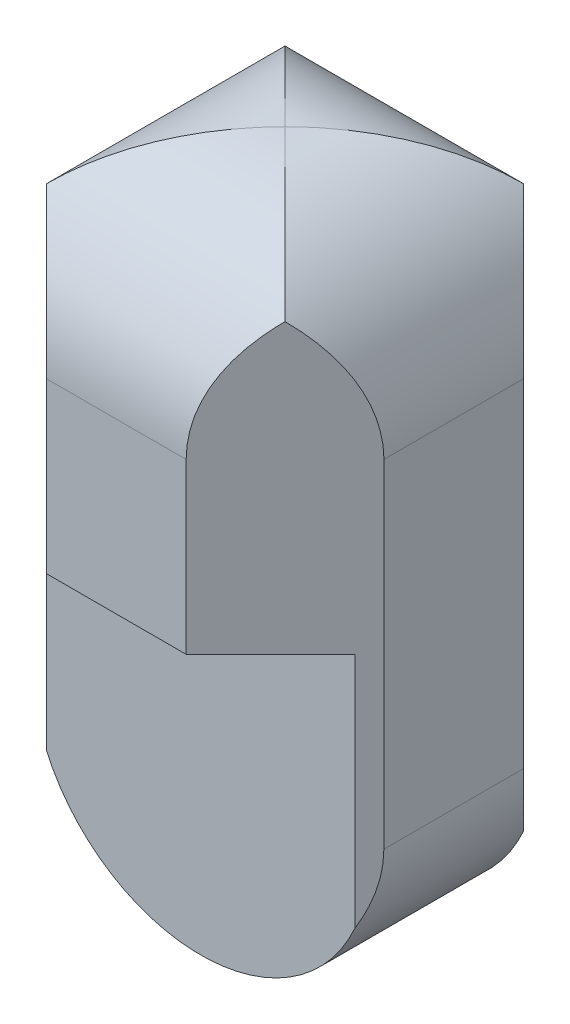
ISO-10303-21;
HEADER;
FILE_DESCRIPTION(('STEP AP214'),'2;1');
FILE_NAME('part.step','',(''),(''),'','','');
FILE_SCHEMA(('AUTOMOTIVE_DESIGN { 1 0 10303 214 1 1 1 1 }'));
ENDSEC;
DATA;
#1=APPLICATION_CONTEXT('core data for automotive mechanical design processes');
#2=APPLICATION_PROTOCOL_DEFINITION('international standard','automotive_design',2000,#1);
#3=PRODUCT_CONTEXT('',#1,'mechanical');
#4=PRODUCT('Part','Part','',(#3));
#5=PRODUCT_RELATED_PRODUCT_CATEGORY('part','',(#4));
#6=PRODUCT_DEFINITION_FORMATION('','',#4);
#7=PRODUCT_DEFINITION_CONTEXT('part definition',#1,'design');
#8=PRODUCT_DEFINITION('design','',#6,#7);
#9=PRODUCT_DEFINITION_SHAPE('','',#8);
#10=(LENGTH_UNIT() NAMED_UNIT(*) SI_UNIT(.MILLI.,.METRE.));
#11=(NAMED_UNIT(*) PLANE_ANGLE_UNIT() SI_UNIT($,.RADIAN.));
#12=(NAMED_UNIT(*) SI_UNIT($,.STERADIAN.) SOLID_ANGLE_UNIT());
#13=UNCERTAINTY_MEASURE_WITH_UNIT(LENGTH_MEASURE(1.E-05),#10,'distance_accuracy_value','');
#14=(GEOMETRIC_REPRESENTATION_CONTEXT(3) GLOBAL_UNCERTAINTY_ASSIGNED_CONTEXT((#13)) GLOBAL_UNIT_ASSIGNED_CONTEXT((#10,
#11,#12)) REPRESENTATION_CONTEXT('',''));
#15=CARTESIAN_POINT('',(0.,0.,0.));
#16=DIRECTION('',(0.,0.,1.));
#17=DIRECTION('',(1.,0.,0.));
#18=AXIS2_PLACEMENT_3D('',#15,#16,#17);
#19=CARTESIAN_POINT('',(4.14213562373094,44.,-10.));
#20=DIRECTION('',(0.,0.,1.));
#21=DIRECTION('',(1.,0.,0.));
#22=AXIS2_PLACEMENT_3D('',#19,#20,#21);
#23=PLANE('',#22);
#24=DIRECTION('',(1.,0.,0.));
#25=VECTOR('',#24,1.);
#26=CARTESIAN_POINT('',(-20.,30.,-9.99999999999999));
#27=LINE('',#26,#25);
#28=CARTESIAN_POINT('',(-4.14213562373095,30.,-10.));
#29=VERTEX_POINT('',#28);
#30=CARTESIAN_POINT('',(4.14213562373095,30.,-10.));
#31=VERTEX_POINT('',#30);
#32=EDGE_CURVE('E138',#29,#31,#27,.T.);
#33=ORIENTED_EDGE('',*,*,#32,.T.);
#34=DIRECTION('',(0.,-1.,0.));
#35=VECTOR('',#34,1.);
#36=CARTESIAN_POINT('',(4.14213562373094,44.,-10.));
#37=LINE('',#36,#35);
#38=CARTESIAN_POINT('',(4.14213562373094,20.,-10.));
#39=VERTEX_POINT('',#38);
#40=EDGE_CURVE('E163',#31,#39,#37,.T.);
#41=ORIENTED_EDGE('',*,*,#40,.T.);
#42=DIRECTION('',(1.,0.,0.));
#43=VECTOR('',#42,1.);
#44=CARTESIAN_POINT('',(10.,20.,-10.));
#45=LINE('',#44,#43);
#46=CARTESIAN_POINT('',(-4.14213562373096,20.,-10.));
#47=VERTEX_POINT('',#46);
#48=EDGE_CURVE('E162',#47,#39,#45,.T.);
#49=ORIENTED_EDGE('',*,*,#48,.F.);
#50=DIRECTION('',(0.,-1.,0.));
#51=VECTOR('',#50,1.);
#52=CARTESIAN_POINT('',(-4.14213562373096,44.,-10.));
#53=LINE('',#52,#51);
#54=EDGE_CURVE('E154',#29,#47,#53,.T.);
#55=ORIENTED_EDGE('',*,*,#54,.F.);
#56=EDGE_LOOP('',(#33,#41,#49,#55));
#57=FACE_BOUND('',#56,.T.);
#58=ADVANCED_FACE('F34',(#57),#23,.F.);
#59=CARTESIAN_POINT('',(0.,30.,-20.));
#60=DIRECTION('',(0.,0.,1.));
#61=DIRECTION('',(1.,0.,0.));
#62=AXIS2_PLACEMENT_3D('',#59,#60,#61);
#63=CYLINDRICAL_SURFACE('',#62,10.);
#64=CARTESIAN_POINT('',(0.,30.,-14.1421356237309));
#65=DIRECTION('',(-0.707106781186547,0.,0.707106781186548));
#66=DIRECTION('',(0.707106781186548,0.,0.707106781186547));
#67=AXIS2_PLACEMENT_3D('',#64,#65,#66);
#68=ELLIPSE('',#67,14.1421356237309,10.);
#69=CARTESIAN_POINT('',(7.07106781186547,37.0710678118655,-7.07106781186548));
#70=VERTEX_POINT('',#69);
#71=CARTESIAN_POINT('',(10.,30.,-4.14213562373095));
#72=VERTEX_POINT('',#71);
#73=EDGE_CURVE('E193',#70,#72,#68,.F.);
#74=ORIENTED_EDGE('',*,*,#73,.F.);
#75=CARTESIAN_POINT('',(0.,30.,0.));
#76=DIRECTION('',(0.707106781186548,0.,0.707106781186547));
#77=DIRECTION('',(-0.707106781186547,0.,0.707106781186548));
#78=AXIS2_PLACEMENT_3D('',#75,#76,#77);
#79=ELLIPSE('',#78,14.142135623731,10.);
#80=CARTESIAN_POINT('',(0.,40.,0.));
#81=VERTEX_POINT('',#80);
#82=EDGE_CURVE('E42',#70,#81,#79,.T.);
#83=ORIENTED_EDGE('',*,*,#82,.T.);
#84=CARTESIAN_POINT('',(0.,30.,0.));
#85=DIRECTION('',(-0.707106781186547,0.,0.707106781186548));
#86=DIRECTION('',(0.707106781186548,0.,0.707106781186547));
#87=AXIS2_PLACEMENT_3D('',#84,#85,#86);
#88=ELLIPSE('',#87,14.1421356237309,10.);
#89=CARTESIAN_POINT('',(7.07106781186548,37.0710678118655,7.07106781186547));
#90=VERTEX_POINT('',#89);
#91=EDGE_CURVE('E185',#81,#90,#88,.F.);
#92=ORIENTED_EDGE('',*,*,#91,.T.);
#93=CARTESIAN_POINT('',(0.,30.,14.1421356237309));
#94=DIRECTION('',(-0.707106781186548,0.,-0.707106781186548));
#95=DIRECTION('',(-0.707106781186548,0.,0.707106781186548));
#96=AXIS2_PLACEMENT_3D('',#93,#94,#95);
#97=ELLIPSE('',#96,14.1421356237309,10.);
#98=CARTESIAN_POINT('',(10.,30.,4.14213562373096));
#99=VERTEX_POINT('',#98);
#100=EDGE_CURVE('E182',#99,#90,#97,.F.);
#101=ORIENTED_EDGE('',*,*,#100,.F.);
#102=DIRECTION('',(0.,0.,1.));
#103=VECTOR('',#102,1.);
#104=CARTESIAN_POINT('',(10.,30.,-20.));
#105=LINE('',#104,#103);
#106=EDGE_CURVE('E208',#72,#99,#105,.T.);
#107=ORIENTED_EDGE('',*,*,#106,.F.);
#108=EDGE_LOOP('',(#74,#83,#92,#101,#107));
#109=FACE_BOUND('',#108,.T.);
#110=ADVANCED_FACE('F191',(#109),#63,.T.);
#111=CARTESIAN_POINT('',(-4.14213562373096,44.,10.));
#112=DIRECTION('',(0.,0.,-1.));
#113=DIRECTION('',(-1.,0.,0.));
#114=AXIS2_PLACEMENT_3D('',#111,#112,#113);
#115=PLANE('',#114);
#116=DIRECTION('',(0.,-1.,0.));
#117=VECTOR('',#116,1.);
#118=CARTESIAN_POINT('',(4.14213562373096,44.,10.));
#119=LINE('',#118,#117);
#120=CARTESIAN_POINT('',(4.14213562373095,30.,9.99999999999999));
#121=VERTEX_POINT('',#120);
#122=CARTESIAN_POINT('',(4.14213562373096,20.,10.));
#123=VERTEX_POINT('',#122);
#124=EDGE_CURVE('E261',#121,#123,#119,.T.);
#125=ORIENTED_EDGE('',*,*,#124,.F.);
#126=DIRECTION('',(1.,0.,0.));
#127=VECTOR('',#126,1.);
#128=CARTESIAN_POINT('',(-20.,30.,10.));
#129=LINE('',#128,#127);
#130=CARTESIAN_POINT('',(-4.14213562373096,30.,10.));
#131=VERTEX_POINT('',#130);
#132=EDGE_CURVE('E148',#131,#121,#129,.T.);
#133=ORIENTED_EDGE('',*,*,#132,.F.);
#134=DIRECTION('',(0.,-1.,0.));
#135=VECTOR('',#134,1.);
#136=CARTESIAN_POINT('',(-4.14213562373096,44.,10.));
#137=LINE('',#136,#135);
#138=CARTESIAN_POINT('',(-4.14213562373096,20.,10.));
#139=VERTEX_POINT('',#138);
#140=EDGE_CURVE('E206',#131,#139,#137,.T.);
#141=ORIENTED_EDGE('',*,*,#140,.T.);
#142=DIRECTION('',(-1.,0.,0.));
#143=VECTOR('',#142,1.);
#144=CARTESIAN_POINT('',(-10.,20.,10.));
#145=LINE('',#144,#143);
#146=EDGE_CURVE('E229',#123,#139,#145,.T.);
#147=ORIENTED_EDGE('',*,*,#146,.F.);
#148=EDGE_LOOP('',(#125,#133,#141,#147));
#149=FACE_BOUND('',#148,.T.);
#150=ADVANCED_FACE('F295',(#149),#115,.F.);
#151=CARTESIAN_POINT('',(10.,44.,4.14213562373095));
#152=DIRECTION('',(-1.,0.,0.));
#153=DIRECTION('',(0.,0.,1.));
#154=AXIS2_PLACEMENT_3D('',#151,#152,#153);
#155=PLANE('',#154);
#156=ORIENTED_EDGE('',*,*,#106,.T.);
#157=DIRECTION('',(0.,-1.,0.));
#158=VECTOR('',#157,1.);
#159=CARTESIAN_POINT('',(10.,44.,4.14213562373095));
#160=LINE('',#159,#158);
#161=CARTESIAN_POINT('',(10.,9.99999999999999,4.14213562373095));
#162=VERTEX_POINT('',#161);
#163=EDGE_CURVE('E259',#99,#162,#160,.T.);
#164=ORIENTED_EDGE('',*,*,#163,.T.);
#165=DIRECTION('',(0.,0.,1.));
#166=VECTOR('',#165,1.);
#167=CARTESIAN_POINT('',(10.,10.,-56.));
#168=LINE('',#167,#166);
#169=CARTESIAN_POINT('',(10.,10.,-4.14213562373095));
#170=VERTEX_POINT('',#169);
#171=EDGE_CURVE('E242',#170,#162,#168,.T.);
#172=ORIENTED_EDGE('',*,*,#171,.F.);
#173=DIRECTION('',(0.,-1.,0.));
#174=VECTOR('',#173,1.);
#175=CARTESIAN_POINT('',(10.,44.,-4.14213562373095));
#176=LINE('',#175,#174);
#177=EDGE_CURVE('E166',#72,#170,#176,.T.);
#178=ORIENTED_EDGE('',*,*,#177,.F.);
#179=EDGE_LOOP('',(#156,#164,#172,#178));
#180=FACE_BOUND('',#179,.T.);
#181=ADVANCED_FACE('F36',(#180),#155,.F.);
#182=CARTESIAN_POINT('',(0.,10.,-56.));
#183=DIRECTION('',(0.,0.,1.));
#184=DIRECTION('',(1.,0.,0.));
#185=AXIS2_PLACEMENT_3D('',#182,#183,#184);
#186=CYLINDRICAL_SURFACE('',#185,10.);
#187=CARTESIAN_POINT('',(0.,10.,-5.));
#188=DIRECTION('',(0.,0.,-1.));
#189=DIRECTION('',(-1.,0.,0.));
#190=AXIS2_PLACEMENT_3D('',#187,#188,#189);
#191=CIRCLE('',#190,10.);
#192=CARTESIAN_POINT('',(9.14213562373095,5.94767273812816,-5.00000000000001));
#193=VERTEX_POINT('',#192);
#194=CARTESIAN_POINT('',(-9.14213562373095,5.94767273812822,-5.));
#195=VERTEX_POINT('',#194);
#196=EDGE_CURVE('E57',#193,#195,#191,.T.);
#197=ORIENTED_EDGE('',*,*,#196,.F.);
#198=CARTESIAN_POINT('',(0.,10.,-14.1421356237309));
#199=DIRECTION('',(-0.707106781186547,0.,0.707106781186548));
#200=DIRECTION('',(0.707106781186548,0.,0.707106781186547));
#201=AXIS2_PLACEMENT_3D('',#198,#199,#200);
#202=ELLIPSE('',#201,14.1421356237309,10.);
#203=EDGE_CURVE('E256',#170,#193,#202,.F.);
#204=ORIENTED_EDGE('',*,*,#203,.F.);
#205=ORIENTED_EDGE('',*,*,#171,.T.);
#206=CARTESIAN_POINT('',(0.,10.,14.1421356237309));
#207=DIRECTION('',(-0.707106781186548,0.,-0.707106781186548));
#208=DIRECTION('',(-0.707106781186548,0.,0.707106781186548));
#209=AXIS2_PLACEMENT_3D('',#206,#207,#208);
#210=ELLIPSE('',#209,14.1421356237309,10.);
#211=CARTESIAN_POINT('',(9.14213562373095,5.94767273812817,5.));
#212=VERTEX_POINT('',#211);
#213=EDGE_CURVE('E250',#212,#162,#210,.F.);
#214=ORIENTED_EDGE('',*,*,#213,.F.);
#215=CARTESIAN_POINT('',(0.,10.,5.));
#216=DIRECTION('',(0.,0.,1.));
#217=DIRECTION('',(1.,0.,0.));
#218=AXIS2_PLACEMENT_3D('',#215,#216,#217);
#219=CIRCLE('',#218,10.);
#220=CARTESIAN_POINT('',(-9.14213562373095,5.94767273812819,5.00000000000001));
#221=VERTEX_POINT('',#220);
#222=EDGE_CURVE('E173',#221,#212,#219,.T.);
#223=ORIENTED_EDGE('',*,*,#222,.F.);
#224=CARTESIAN_POINT('',(0.,10.,14.142135623731));
#225=DIRECTION('',(0.707106781186548,0.,-0.707106781186547));
#226=DIRECTION('',(0.707106781186547,0.,0.707106781186548));
#227=AXIS2_PLACEMENT_3D('',#224,#225,#226);
#228=ELLIPSE('',#227,14.142135623731,10.);
#229=CARTESIAN_POINT('',(-10.,10.,4.14213562373096));
#230=VERTEX_POINT('',#229);
#231=EDGE_CURVE('E253',#230,#221,#228,.F.);
#232=ORIENTED_EDGE('',*,*,#231,.F.);
#233=DIRECTION('',(0.,0.,1.));
#234=VECTOR('',#233,1.);
#235=CARTESIAN_POINT('',(-10.,10.,-56.));
#236=LINE('',#235,#234);
#237=CARTESIAN_POINT('',(-10.,10.,-4.14213562373095));
#238=VERTEX_POINT('',#237);
#239=EDGE_CURVE('E241',#238,#230,#236,.T.);
#240=ORIENTED_EDGE('',*,*,#239,.F.);
#241=CARTESIAN_POINT('',(0.,10.,-14.142135623731));
#242=DIRECTION('',(0.707106781186548,0.,0.707106781186547));
#243=DIRECTION('',(-0.707106781186547,0.,0.707106781186548));
#244=AXIS2_PLACEMENT_3D('',#241,#242,#243);
#245=ELLIPSE('',#244,14.142135623731,10.);
#246=EDGE_CURVE('E245',#195,#238,#245,.F.);
#247=ORIENTED_EDGE('',*,*,#246,.F.);
#248=EDGE_LOOP('',(#197,#204,#205,#214,#223,#232,#240,#247));
#249=FACE_BOUND('',#248,.T.);
#250=ADVANCED_FACE('F271',(#249),#186,.T.);
#251=CARTESIAN_POINT('',(-10.,44.,-4.14213562373095));
#252=DIRECTION('',(1.,0.,0.));
#253=DIRECTION('',(0.,0.,-1.));
#254=AXIS2_PLACEMENT_3D('',#251,#252,#253);
#255=PLANE('',#254);
#256=DIRECTION('',(0.,-1.,0.));
#257=VECTOR('',#256,1.);
#258=CARTESIAN_POINT('',(-10.,44.,4.14213562373096));
#259=LINE('',#258,#257);
#260=CARTESIAN_POINT('',(-10.,30.,4.14213562373096));
#261=VERTEX_POINT('',#260);
#262=EDGE_CURVE('E168',#261,#230,#259,.T.);
#263=ORIENTED_EDGE('',*,*,#262,.F.);
#264=DIRECTION('',(0.,0.,1.));
#265=VECTOR('',#264,1.);
#266=CARTESIAN_POINT('',(-10.,30.,-20.));
#267=LINE('',#266,#265);
#268=CARTESIAN_POINT('',(-10.,30.,-4.14213562373095));
#269=VERTEX_POINT('',#268);
#270=EDGE_CURVE('E212',#269,#261,#267,.T.);
#271=ORIENTED_EDGE('',*,*,#270,.F.);
#272=DIRECTION('',(0.,-1.,0.));
#273=VECTOR('',#272,1.);
#274=CARTESIAN_POINT('',(-10.,44.,-4.14213562373095));
#275=LINE('',#274,#273);
#276=EDGE_CURVE('E164',#269,#238,#275,.T.);
#277=ORIENTED_EDGE('',*,*,#276,.T.);
#278=ORIENTED_EDGE('',*,*,#239,.T.);
#279=EDGE_LOOP('',(#263,#271,#277,#278));
#280=FACE_BOUND('',#279,.T.);
#281=ADVANCED_FACE('F274',(#280),#255,.F.);
#282=CARTESIAN_POINT('',(10.,44.,-4.14213562373095));
#283=DIRECTION('',(-0.707106781186547,0.,0.707106781186548));
#284=DIRECTION('',(0.707106781186548,0.,0.707106781186547));
#285=AXIS2_PLACEMENT_3D('',#282,#283,#284);
#286=PLANE('',#285);
#287=ORIENTED_EDGE('',*,*,#40,.F.);
#288=CARTESIAN_POINT('',(14.1421356237309,30.,0.));
#289=DIRECTION('',(-0.707106781186547,0.,0.707106781186548));
#290=DIRECTION('',(0.707106781186548,0.,0.707106781186547));
#291=AXIS2_PLACEMENT_3D('',#288,#289,#290);
#292=ELLIPSE('',#291,14.1421356237309,10.);
#293=EDGE_CURVE('E144',#31,#70,#292,.F.);
#294=ORIENTED_EDGE('',*,*,#293,.T.);
#295=ORIENTED_EDGE('',*,*,#73,.T.);
#296=ORIENTED_EDGE('',*,*,#177,.T.);
#297=ORIENTED_EDGE('',*,*,#203,.T.);
#298=DIRECTION('',(0.,-1.,0.));
#299=VECTOR('',#298,1.);
#300=CARTESIAN_POINT('',(9.14213562373095,44.,-5.00000000000001));
#301=LINE('',#300,#299);
#302=CARTESIAN_POINT('',(9.14213562373095,20.,-5.00000000000001));
#303=VERTEX_POINT('',#302);
#304=EDGE_CURVE('E223',#303,#193,#301,.T.);
#305=ORIENTED_EDGE('',*,*,#304,.F.);
#306=DIRECTION('',(-0.707106781186548,0.,-0.707106781186547));
#307=VECTOR('',#306,1.);
#308=CARTESIAN_POINT('',(10.,20.,-4.14213562373095));
#309=LINE('',#308,#307);
#310=EDGE_CURVE('E226',#303,#39,#309,.T.);
#311=ORIENTED_EDGE('',*,*,#310,.T.);
#312=EDGE_LOOP('',(#287,#294,#295,#296,#297,#305,#311));
#313=FACE_BOUND('',#312,.T.);
#314=ADVANCED_FACE('F279',(#313),#286,.F.);
#315=CARTESIAN_POINT('',(-4.14213562373096,44.,-10.));
#316=DIRECTION('',(0.707106781186548,0.,0.707106781186547));
#317=DIRECTION('',(0.707106781186547,0.,-0.707106781186548));
#318=AXIS2_PLACEMENT_3D('',#315,#316,#317);
#319=PLANE('',#318);
#320=CARTESIAN_POINT('',(0.,30.,-14.142135623731));
#321=DIRECTION('',(0.707106781186548,0.,0.707106781186547));
#322=DIRECTION('',(-0.707106781186547,0.,0.707106781186548));
#323=AXIS2_PLACEMENT_3D('',#320,#321,#322);
#324=ELLIPSE('',#323,14.142135623731,10.);
#325=CARTESIAN_POINT('',(-7.07106781186548,37.0710678118655,-7.07106781186548));
#326=VERTEX_POINT('',#325);
#327=EDGE_CURVE('E157',#269,#326,#324,.F.);
#328=ORIENTED_EDGE('',*,*,#327,.T.);
#329=CARTESIAN_POINT('',(-14.142135623731,30.,0.));
#330=DIRECTION('',(0.707106781186548,0.,0.707106781186547));
#331=DIRECTION('',(0.707106781186547,0.,-0.707106781186548));
#332=AXIS2_PLACEMENT_3D('',#329,#330,#331);
#333=ELLIPSE('',#332,14.142135623731,10.);
#334=EDGE_CURVE('E141',#326,#29,#333,.F.);
#335=ORIENTED_EDGE('',*,*,#334,.T.);
#336=ORIENTED_EDGE('',*,*,#54,.T.);
#337=DIRECTION('',(-0.707106781186547,0.,0.707106781186548));
#338=VECTOR('',#337,1.);
#339=CARTESIAN_POINT('',(-4.14213562373096,20.,-10.));
#340=LINE('',#339,#338);
#341=CARTESIAN_POINT('',(-9.14213562373096,20.,-5.));
#342=VERTEX_POINT('',#341);
#343=EDGE_CURVE('E180',#47,#342,#340,.T.);
#344=ORIENTED_EDGE('',*,*,#343,.T.);
#345=DIRECTION('',(0.,1.,0.));
#346=VECTOR('',#345,1.);
#347=CARTESIAN_POINT('',(-9.14213562373095,44.,-5.));
#348=LINE('',#347,#346);
#349=EDGE_CURVE('E178',#195,#342,#348,.T.);
#350=ORIENTED_EDGE('',*,*,#349,.F.);
#351=ORIENTED_EDGE('',*,*,#246,.T.);
#352=ORIENTED_EDGE('',*,*,#276,.F.);
#353=EDGE_LOOP('',(#328,#335,#336,#344,#350,#351,#352));
#354=FACE_BOUND('',#353,.T.);
#355=ADVANCED_FACE('F152',(#354),#319,.F.);
#356=CARTESIAN_POINT('',(-10.,44.,4.14213562373096));
#357=DIRECTION('',(0.707106781186548,0.,-0.707106781186547));
#358=DIRECTION('',(-0.707106781186547,0.,-0.707106781186548));
#359=AXIS2_PLACEMENT_3D('',#356,#357,#358);
#360=PLANE('',#359);
#361=ORIENTED_EDGE('',*,*,#140,.F.);
#362=CARTESIAN_POINT('',(-14.1421356237309,30.,0.));
#363=DIRECTION('',(0.707106781186548,0.,-0.707106781186547));
#364=DIRECTION('',(0.707106781186547,0.,0.707106781186548));
#365=AXIS2_PLACEMENT_3D('',#362,#363,#364);
#366=ELLIPSE('',#365,14.1421356237309,10.);
#367=CARTESIAN_POINT('',(-7.07106781186548,37.0710678118655,7.07106781186548));
#368=VERTEX_POINT('',#367);
#369=EDGE_CURVE('E158',#131,#368,#366,.F.);
#370=ORIENTED_EDGE('',*,*,#369,.T.);
#371=CARTESIAN_POINT('',(0.,30.,14.142135623731));
#372=DIRECTION('',(0.707106781186548,0.,-0.707106781186547));
#373=DIRECTION('',(0.707106781186547,0.,0.707106781186548));
#374=AXIS2_PLACEMENT_3D('',#371,#372,#373);
#375=ELLIPSE('',#374,14.142135623731,10.);
#376=EDGE_CURVE('E198',#368,#261,#375,.F.);
#377=ORIENTED_EDGE('',*,*,#376,.T.);
#378=ORIENTED_EDGE('',*,*,#262,.T.);
#379=ORIENTED_EDGE('',*,*,#231,.T.);
#380=DIRECTION('',(0.,-1.,0.));
#381=VECTOR('',#380,1.);
#382=CARTESIAN_POINT('',(-9.14213562373095,44.,5.));
#383=LINE('',#382,#381);
#384=CARTESIAN_POINT('',(-9.14213562373095,20.,5.));
#385=VERTEX_POINT('',#384);
#386=EDGE_CURVE('E237',#385,#221,#383,.T.);
#387=ORIENTED_EDGE('',*,*,#386,.F.);
#388=DIRECTION('',(0.707106781186547,0.,0.707106781186548));
#389=VECTOR('',#388,1.);
#390=CARTESIAN_POINT('',(-10.,20.,4.14213562373096));
#391=LINE('',#390,#389);
#392=EDGE_CURVE('E239',#385,#139,#391,.T.);
#393=ORIENTED_EDGE('',*,*,#392,.T.);
#394=EDGE_LOOP('',(#361,#370,#377,#378,#379,#387,#393));
#395=FACE_BOUND('',#394,.T.);
#396=ADVANCED_FACE('F204',(#395),#360,.F.);
#397=CARTESIAN_POINT('',(4.14213562373096,44.,10.));
#398=DIRECTION('',(-0.707106781186548,0.,-0.707106781186548));
#399=DIRECTION('',(-0.707106781186548,0.,0.707106781186548));
#400=AXIS2_PLACEMENT_3D('',#397,#398,#399);
#401=PLANE('',#400);
#402=ORIENTED_EDGE('',*,*,#100,.T.);
#403=CARTESIAN_POINT('',(14.142135623731,30.,0.));
#404=DIRECTION('',(-0.707106781186548,0.,-0.707106781186548));
#405=DIRECTION('',(0.707106781186548,0.,-0.707106781186548));
#406=AXIS2_PLACEMENT_3D('',#403,#404,#405);
#407=ELLIPSE('',#406,14.142135623731,10.);
#408=EDGE_CURVE('E49',#90,#121,#407,.F.);
#409=ORIENTED_EDGE('',*,*,#408,.T.);
#410=ORIENTED_EDGE('',*,*,#124,.T.);
#411=DIRECTION('',(0.707106781186548,0.,-0.707106781186548));
#412=VECTOR('',#411,1.);
#413=CARTESIAN_POINT('',(4.14213562373096,20.,10.));
#414=LINE('',#413,#412);
#415=CARTESIAN_POINT('',(9.14213562373096,20.,5.));
#416=VERTEX_POINT('',#415);
#417=EDGE_CURVE('E175',#123,#416,#414,.T.);
#418=ORIENTED_EDGE('',*,*,#417,.T.);
#419=DIRECTION('',(0.,1.,0.));
#420=VECTOR('',#419,1.);
#421=CARTESIAN_POINT('',(9.14213562373095,44.,5.));
#422=LINE('',#421,#420);
#423=EDGE_CURVE('E233',#212,#416,#422,.T.);
#424=ORIENTED_EDGE('',*,*,#423,.F.);
#425=ORIENTED_EDGE('',*,*,#213,.T.);
#426=ORIENTED_EDGE('',*,*,#163,.F.);
#427=EDGE_LOOP('',(#402,#409,#410,#418,#424,#425,#426));
#428=FACE_BOUND('',#427,.T.);
#429=ADVANCED_FACE('F285',(#428),#401,.F.);
#430=CARTESIAN_POINT('',(-10.,20.,5.));
#431=DIRECTION('',(0.,1.,0.));
#432=DIRECTION('',(0.,0.,1.));
#433=AXIS2_PLACEMENT_3D('',#430,#431,#432);
#434=PLANE('',#433);
#435=DIRECTION('',(-1.,0.,0.));
#436=VECTOR('',#435,1.);
#437=CARTESIAN_POINT('',(-10.,20.,5.));
#438=LINE('',#437,#436);
#439=EDGE_CURVE('E230',#416,#385,#438,.T.);
#440=ORIENTED_EDGE('',*,*,#439,.F.);
#441=ORIENTED_EDGE('',*,*,#417,.F.);
#442=ORIENTED_EDGE('',*,*,#146,.T.);
#443=ORIENTED_EDGE('',*,*,#392,.F.);
#444=EDGE_LOOP('',(#440,#441,#442,#443));
#445=FACE_BOUND('',#444,.T.);
#446=ADVANCED_FACE('F291',(#445),#434,.F.);
#447=CARTESIAN_POINT('',(0.,10.,5.));
#448=DIRECTION('',(0.,0.,1.));
#449=DIRECTION('',(1.,0.,0.));
#450=AXIS2_PLACEMENT_3D('',#447,#448,#449);
#451=PLANE('',#450);
#452=ORIENTED_EDGE('',*,*,#386,.T.);
#453=ORIENTED_EDGE('',*,*,#222,.T.);
#454=ORIENTED_EDGE('',*,*,#423,.T.);
#455=ORIENTED_EDGE('',*,*,#439,.T.);
#456=EDGE_LOOP('',(#452,#453,#454,#455));
#457=FACE_BOUND('',#456,.T.);
#458=ADVANCED_FACE('F289',(#457),#451,.T.);
#459=CARTESIAN_POINT('',(10.,20.,-5.00000000000001));
#460=DIRECTION('',(0.,1.,0.));
#461=DIRECTION('',(0.,0.,1.));
#462=AXIS2_PLACEMENT_3D('',#459,#460,#461);
#463=PLANE('',#462);
#464=DIRECTION('',(1.,0.,0.));
#465=VECTOR('',#464,1.);
#466=CARTESIAN_POINT('',(10.,20.,-5.00000000000001));
#467=LINE('',#466,#465);
#468=EDGE_CURVE('E220',#342,#303,#467,.T.);
#469=ORIENTED_EDGE('',*,*,#468,.F.);
#470=ORIENTED_EDGE('',*,*,#343,.F.);
#471=ORIENTED_EDGE('',*,*,#48,.T.);
#472=ORIENTED_EDGE('',*,*,#310,.F.);
#473=EDGE_LOOP('',(#469,#470,#471,#472));
#474=FACE_BOUND('',#473,.T.);
#475=ADVANCED_FACE('F332',(#474),#463,.F.);
#476=CARTESIAN_POINT('',(0.,10.,-5.));
#477=DIRECTION('',(0.,0.,-1.));
#478=DIRECTION('',(-1.,0.,0.));
#479=AXIS2_PLACEMENT_3D('',#476,#477,#478);
#480=PLANE('',#479);
#481=ORIENTED_EDGE('',*,*,#304,.T.);
#482=ORIENTED_EDGE('',*,*,#196,.T.);
#483=ORIENTED_EDGE('',*,*,#349,.T.);
#484=ORIENTED_EDGE('',*,*,#468,.T.);
#485=EDGE_LOOP('',(#481,#482,#483,#484));
#486=FACE_BOUND('',#485,.T.);
#487=ADVANCED_FACE('F335',(#486),#480,.T.);
#488=ORIENTED_EDGE('',*,*,#376,.F.);
#489=CARTESIAN_POINT('',(0.,30.,0.));
#490=DIRECTION('',(0.707106781186548,0.,0.707106781186547));
#491=DIRECTION('',(-0.707106781186547,0.,0.707106781186548));
#492=AXIS2_PLACEMENT_3D('',#489,#490,#491);
#493=ELLIPSE('',#492,14.142135623731,10.);
#494=EDGE_CURVE('E11',#368,#81,#493,.F.);
#495=ORIENTED_EDGE('',*,*,#494,.T.);
#496=CARTESIAN_POINT('',(0.,30.,0.));
#497=DIRECTION('',(-0.707106781186547,0.,0.707106781186548));
#498=DIRECTION('',(0.707106781186548,0.,0.707106781186547));
#499=AXIS2_PLACEMENT_3D('',#496,#497,#498);
#500=ELLIPSE('',#499,14.1421356237309,10.);
#501=EDGE_CURVE('E187',#81,#326,#500,.T.);
#502=ORIENTED_EDGE('',*,*,#501,.T.);
#503=ORIENTED_EDGE('',*,*,#327,.F.);
#504=ORIENTED_EDGE('',*,*,#270,.T.);
#505=EDGE_LOOP('',(#488,#495,#502,#503,#504));
#506=FACE_BOUND('',#505,.T.);
#507=ADVANCED_FACE('F196',(#506),#63,.T.);
#508=CARTESIAN_POINT('',(-20.,30.,0.));
#509=DIRECTION('',(1.,0.,0.));
#510=DIRECTION('',(0.,0.,-1.));
#511=AXIS2_PLACEMENT_3D('',#508,#509,#510);
#512=CYLINDRICAL_SURFACE('',#511,10.);
#513=ORIENTED_EDGE('',*,*,#132,.T.);
#514=ORIENTED_EDGE('',*,*,#408,.F.);
#515=ORIENTED_EDGE('',*,*,#91,.F.);
#516=ORIENTED_EDGE('',*,*,#494,.F.);
#517=ORIENTED_EDGE('',*,*,#369,.F.);
#518=EDGE_LOOP('',(#513,#514,#515,#516,#517));
#519=FACE_BOUND('',#518,.T.);
#520=ADVANCED_FACE('F200',(#519),#512,.T.);
#521=ORIENTED_EDGE('',*,*,#32,.F.);
#522=ORIENTED_EDGE('',*,*,#334,.F.);
#523=ORIENTED_EDGE('',*,*,#501,.F.);
#524=ORIENTED_EDGE('',*,*,#82,.F.);
#525=ORIENTED_EDGE('',*,*,#293,.F.);
#526=EDGE_LOOP('',(#521,#522,#523,#524,#525));
#527=FACE_BOUND('',#526,.T.);
#528=ADVANCED_FACE('F140',(#527),#512,.T.);
#529=CLOSED_SHELL('',(#58,#110,#150,#181,#250,#281,#314,#355,#396,#429,#446,#458,#475,#487,#507,
#520,#528));
#530=MANIFOLD_SOLID_BREP('B2',#529);
#531=ADVANCED_BREP_SHAPE_REPRESENTATION('',(#18,#530),#14);
#532=SHAPE_DEFINITION_REPRESENTATION(#9,#531);
ENDSEC;
END-ISO-10303-21;
